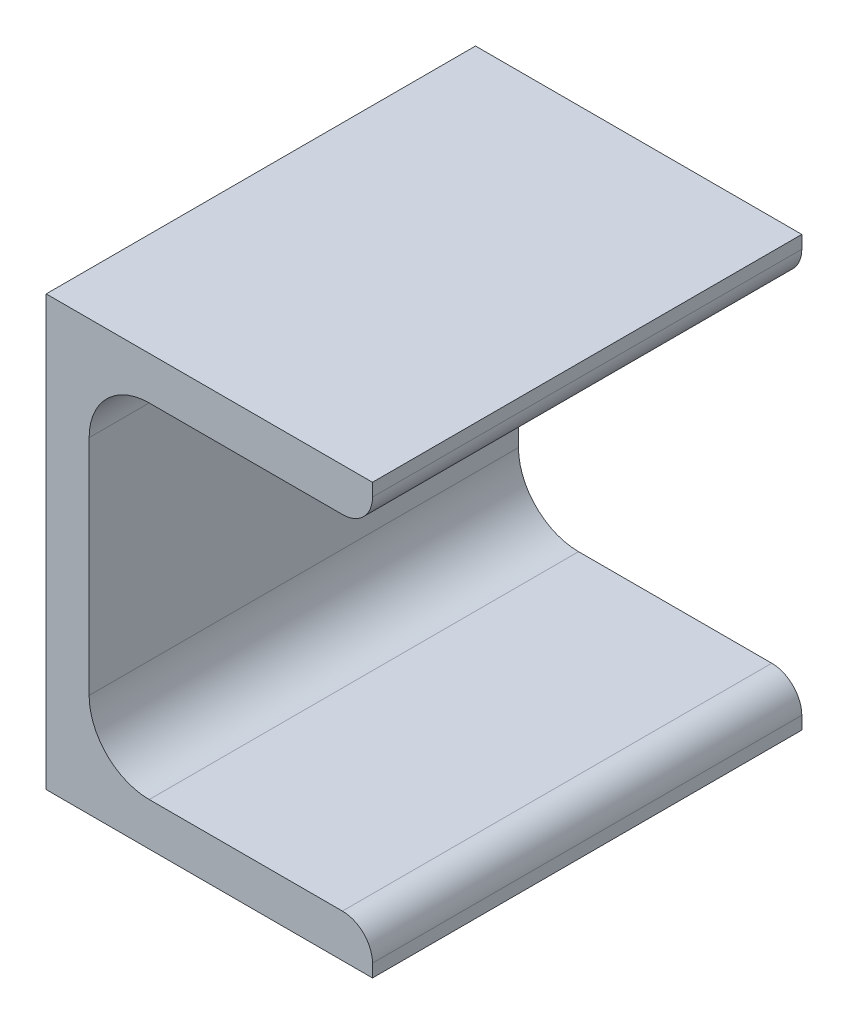
ISO-10303-21;
HEADER;
FILE_DESCRIPTION(('STEP AP214'),'2;1');
FILE_NAME('part.step','',(''),(''),'','','');
FILE_SCHEMA(('AUTOMOTIVE_DESIGN { 1 0 10303 214 1 1 1 1 }'));
ENDSEC;
DATA;
#1=APPLICATION_CONTEXT('core data for automotive mechanical design processes');
#2=APPLICATION_PROTOCOL_DEFINITION('international standard','automotive_design',2000,#1);
#3=PRODUCT_CONTEXT('',#1,'mechanical');
#4=PRODUCT('Part','Part','',(#3));
#5=PRODUCT_RELATED_PRODUCT_CATEGORY('part','',(#4));
#6=PRODUCT_DEFINITION_FORMATION('','',#4);
#7=PRODUCT_DEFINITION_CONTEXT('part definition',#1,'design');
#8=PRODUCT_DEFINITION('design','',#6,#7);
#9=PRODUCT_DEFINITION_SHAPE('','',#8);
#10=(LENGTH_UNIT() NAMED_UNIT(*) SI_UNIT(.MILLI.,.METRE.));
#11=(NAMED_UNIT(*) PLANE_ANGLE_UNIT() SI_UNIT($,.RADIAN.));
#12=(NAMED_UNIT(*) SI_UNIT($,.STERADIAN.) SOLID_ANGLE_UNIT());
#13=UNCERTAINTY_MEASURE_WITH_UNIT(LENGTH_MEASURE(1.E-05),#10,'distance_accuracy_value','');
#14=(GEOMETRIC_REPRESENTATION_CONTEXT(3) GLOBAL_UNCERTAINTY_ASSIGNED_CONTEXT((#13)) GLOBAL_UNIT_ASSIGNED_CONTEXT((#10,
#11,#12)) REPRESENTATION_CONTEXT('',''));
#15=CARTESIAN_POINT('',(0.,0.,0.));
#16=DIRECTION('',(0.,0.,1.));
#17=DIRECTION('',(1.,0.,0.));
#18=AXIS2_PLACEMENT_3D('',#15,#16,#17);
#19=CARTESIAN_POINT('',(38.,0.,50.));
#20=DIRECTION('',(0.,-1.,0.));
#21=DIRECTION('',(1.,0.,0.));
#22=AXIS2_PLACEMENT_3D('',#19,#20,#21);
#23=PLANE('',#22);
#24=DIRECTION('',(-1.,0.,0.));
#25=VECTOR('',#24,1.);
#26=CARTESIAN_POINT('',(38.,0.,0.));
#27=LINE('',#26,#25);
#28=CARTESIAN_POINT('',(38.,0.,0.));
#29=VERTEX_POINT('',#28);
#30=CARTESIAN_POINT('',(0.,0.,0.));
#31=VERTEX_POINT('',#30);
#32=EDGE_CURVE('E153',#29,#31,#27,.T.);
#33=ORIENTED_EDGE('',*,*,#32,.T.);
#34=DIRECTION('',(0.,0.,-1.));
#35=VECTOR('',#34,1.);
#36=CARTESIAN_POINT('',(0.,0.,50.));
#37=LINE('',#36,#35);
#38=CARTESIAN_POINT('',(0.,0.,50.));
#39=VERTEX_POINT('',#38);
#40=EDGE_CURVE('E11',#39,#31,#37,.T.);
#41=ORIENTED_EDGE('',*,*,#40,.F.);
#42=DIRECTION('',(-1.,0.,0.));
#43=VECTOR('',#42,1.);
#44=CARTESIAN_POINT('',(38.,0.,50.));
#45=LINE('',#44,#43);
#46=CARTESIAN_POINT('',(38.,0.,50.));
#47=VERTEX_POINT('',#46);
#48=EDGE_CURVE('E175',#47,#39,#45,.T.);
#49=ORIENTED_EDGE('',*,*,#48,.F.);
#50=DIRECTION('',(0.,0.,-1.));
#51=VECTOR('',#50,1.);
#52=CARTESIAN_POINT('',(38.,0.,50.));
#53=LINE('',#52,#51);
#54=EDGE_CURVE('E149',#47,#29,#53,.T.);
#55=ORIENTED_EDGE('',*,*,#54,.T.);
#56=EDGE_LOOP('',(#33,#41,#49,#55));
#57=FACE_BOUND('',#56,.T.);
#58=ADVANCED_FACE('F33',(#57),#23,.F.);
#59=CARTESIAN_POINT('',(0.,0.,50.));
#60=DIRECTION('',(1.,0.,0.));
#61=DIRECTION('',(0.,0.,-1.));
#62=AXIS2_PLACEMENT_3D('',#59,#60,#61);
#63=PLANE('',#62);
#64=DIRECTION('',(0.,-1.,0.));
#65=VECTOR('',#64,1.);
#66=CARTESIAN_POINT('',(0.,0.,0.));
#67=LINE('',#66,#65);
#68=CARTESIAN_POINT('',(0.,-50.,0.));
#69=VERTEX_POINT('',#68);
#70=EDGE_CURVE('E156',#31,#69,#67,.T.);
#71=ORIENTED_EDGE('',*,*,#70,.T.);
#72=DIRECTION('',(0.,0.,-1.));
#73=VECTOR('',#72,1.);
#74=CARTESIAN_POINT('',(0.,-50.,50.));
#75=LINE('',#74,#73);
#76=CARTESIAN_POINT('',(0.,-50.,50.));
#77=VERTEX_POINT('',#76);
#78=EDGE_CURVE('E41',#77,#69,#75,.T.);
#79=ORIENTED_EDGE('',*,*,#78,.F.);
#80=DIRECTION('',(0.,-1.,0.));
#81=VECTOR('',#80,1.);
#82=CARTESIAN_POINT('',(0.,0.,50.));
#83=LINE('',#82,#81);
#84=EDGE_CURVE('E104',#39,#77,#83,.T.);
#85=ORIENTED_EDGE('',*,*,#84,.F.);
#86=ORIENTED_EDGE('',*,*,#40,.T.);
#87=EDGE_LOOP('',(#71,#79,#85,#86));
#88=FACE_BOUND('',#87,.T.);
#89=ADVANCED_FACE('F253',(#88),#63,.F.);
#90=CARTESIAN_POINT('',(0.,-50.,50.));
#91=DIRECTION('',(0.,1.,0.));
#92=DIRECTION('',(-1.,0.,0.));
#93=AXIS2_PLACEMENT_3D('',#90,#91,#92);
#94=PLANE('',#93);
#95=DIRECTION('',(1.,0.,0.));
#96=VECTOR('',#95,1.);
#97=CARTESIAN_POINT('',(0.,-50.,0.));
#98=LINE('',#97,#96);
#99=CARTESIAN_POINT('',(38.,-50.,0.));
#100=VERTEX_POINT('',#99);
#101=EDGE_CURVE('E158',#69,#100,#98,.T.);
#102=ORIENTED_EDGE('',*,*,#101,.T.);
#103=DIRECTION('',(0.,0.,-1.));
#104=VECTOR('',#103,1.);
#105=CARTESIAN_POINT('',(38.,-50.,50.));
#106=LINE('',#105,#104);
#107=CARTESIAN_POINT('',(38.,-50.,50.));
#108=VERTEX_POINT('',#107);
#109=EDGE_CURVE('E194',#108,#100,#106,.T.);
#110=ORIENTED_EDGE('',*,*,#109,.F.);
#111=DIRECTION('',(1.,0.,0.));
#112=VECTOR('',#111,1.);
#113=CARTESIAN_POINT('',(0.,-50.,50.));
#114=LINE('',#113,#112);
#115=EDGE_CURVE('E202',#77,#108,#114,.T.);
#116=ORIENTED_EDGE('',*,*,#115,.F.);
#117=ORIENTED_EDGE('',*,*,#78,.T.);
#118=EDGE_LOOP('',(#102,#110,#116,#117));
#119=FACE_BOUND('',#118,.T.);
#120=ADVANCED_FACE('F200',(#119),#94,.F.);
#121=CARTESIAN_POINT('',(38.,-50.,50.));
#122=DIRECTION('',(-1.,0.,0.));
#123=DIRECTION('',(0.,0.,1.));
#124=AXIS2_PLACEMENT_3D('',#121,#122,#123);
#125=PLANE('',#124);
#126=DIRECTION('',(0.,1.,0.));
#127=VECTOR('',#126,1.);
#128=CARTESIAN_POINT('',(38.,-50.,0.));
#129=LINE('',#128,#127);
#130=CARTESIAN_POINT('',(38.,-48.5,0.));
#131=VERTEX_POINT('',#130);
#132=EDGE_CURVE('E160',#100,#131,#129,.T.);
#133=ORIENTED_EDGE('',*,*,#132,.T.);
#134=DIRECTION('',(0.,0.,-1.));
#135=VECTOR('',#134,1.);
#136=CARTESIAN_POINT('',(38.,-48.5,50.));
#137=LINE('',#136,#135);
#138=CARTESIAN_POINT('',(38.,-48.5,50.));
#139=VERTEX_POINT('',#138);
#140=EDGE_CURVE('E191',#139,#131,#137,.T.);
#141=ORIENTED_EDGE('',*,*,#140,.F.);
#142=DIRECTION('',(0.,1.,0.));
#143=VECTOR('',#142,1.);
#144=CARTESIAN_POINT('',(38.,-50.,50.));
#145=LINE('',#144,#143);
#146=EDGE_CURVE('E220',#108,#139,#145,.T.);
#147=ORIENTED_EDGE('',*,*,#146,.F.);
#148=ORIENTED_EDGE('',*,*,#109,.T.);
#149=EDGE_LOOP('',(#133,#141,#147,#148));
#150=FACE_BOUND('',#149,.T.);
#151=ADVANCED_FACE('F211',(#150),#125,.F.);
#152=CARTESIAN_POINT('',(34.5,-48.5,50.));
#153=DIRECTION('',(0.,0.,-1.));
#154=DIRECTION('',(-1.,0.,0.));
#155=AXIS2_PLACEMENT_3D('',#152,#153,#154);
#156=CYLINDRICAL_SURFACE('',#155,3.5);
#157=CARTESIAN_POINT('',(34.5,-48.5,0.));
#158=DIRECTION('',(0.,0.,1.));
#159=DIRECTION('',(1.,0.,0.));
#160=AXIS2_PLACEMENT_3D('',#157,#158,#159);
#161=CIRCLE('',#160,3.5);
#162=CARTESIAN_POINT('',(34.5,-45.,0.));
#163=VERTEX_POINT('',#162);
#164=EDGE_CURVE('E162',#131,#163,#161,.T.);
#165=ORIENTED_EDGE('',*,*,#164,.T.);
#166=DIRECTION('',(0.,0.,-1.));
#167=VECTOR('',#166,1.);
#168=CARTESIAN_POINT('',(34.5,-45.,50.));
#169=LINE('',#168,#167);
#170=CARTESIAN_POINT('',(34.5,-45.,50.));
#171=VERTEX_POINT('',#170);
#172=EDGE_CURVE('E188',#171,#163,#169,.T.);
#173=ORIENTED_EDGE('',*,*,#172,.F.);
#174=CARTESIAN_POINT('',(34.5,-48.5,50.));
#175=DIRECTION('',(0.,0.,1.));
#176=DIRECTION('',(1.,0.,0.));
#177=AXIS2_PLACEMENT_3D('',#174,#175,#176);
#178=CIRCLE('',#177,3.5);
#179=EDGE_CURVE('E217',#139,#171,#178,.T.);
#180=ORIENTED_EDGE('',*,*,#179,.F.);
#181=ORIENTED_EDGE('',*,*,#140,.T.);
#182=EDGE_LOOP('',(#165,#173,#180,#181));
#183=FACE_BOUND('',#182,.T.);
#184=ADVANCED_FACE('F215',(#183),#156,.T.);
#185=CARTESIAN_POINT('',(34.5,-45.,50.));
#186=DIRECTION('',(0.,-1.,0.));
#187=DIRECTION('',(1.,0.,0.));
#188=AXIS2_PLACEMENT_3D('',#185,#186,#187);
#189=PLANE('',#188);
#190=DIRECTION('',(-1.,0.,0.));
#191=VECTOR('',#190,1.);
#192=CARTESIAN_POINT('',(34.5,-45.,0.));
#193=LINE('',#192,#191);
#194=CARTESIAN_POINT('',(12.0000000000001,-45.,0.));
#195=VERTEX_POINT('',#194);
#196=EDGE_CURVE('E164',#163,#195,#193,.T.);
#197=ORIENTED_EDGE('',*,*,#196,.T.);
#198=DIRECTION('',(0.,0.,-1.));
#199=VECTOR('',#198,1.);
#200=CARTESIAN_POINT('',(12.0000000000001,-45.,50.));
#201=LINE('',#200,#199);
#202=CARTESIAN_POINT('',(12.0000000000001,-45.,50.));
#203=VERTEX_POINT('',#202);
#204=EDGE_CURVE('E185',#203,#195,#201,.T.);
#205=ORIENTED_EDGE('',*,*,#204,.F.);
#206=DIRECTION('',(-1.,0.,0.));
#207=VECTOR('',#206,1.);
#208=CARTESIAN_POINT('',(34.5,-45.,50.));
#209=LINE('',#208,#207);
#210=EDGE_CURVE('E219',#171,#203,#209,.T.);
#211=ORIENTED_EDGE('',*,*,#210,.F.);
#212=ORIENTED_EDGE('',*,*,#172,.T.);
#213=EDGE_LOOP('',(#197,#205,#211,#212));
#214=FACE_BOUND('',#213,.T.);
#215=ADVANCED_FACE('F266',(#214),#189,.F.);
#216=CARTESIAN_POINT('',(12.,-38.,50.));
#217=DIRECTION('',(0.,0.,-1.));
#218=DIRECTION('',(-1.,0.,0.));
#219=AXIS2_PLACEMENT_3D('',#216,#217,#218);
#220=CYLINDRICAL_SURFACE('',#219,7.);
#221=CARTESIAN_POINT('',(12.,-38.,0.));
#222=DIRECTION('',(0.,0.,-1.));
#223=DIRECTION('',(-1.,0.,0.));
#224=AXIS2_PLACEMENT_3D('',#221,#222,#223);
#225=CIRCLE('',#224,7.);
#226=CARTESIAN_POINT('',(5.,-38.,0.));
#227=VERTEX_POINT('',#226);
#228=EDGE_CURVE('E166',#195,#227,#225,.T.);
#229=ORIENTED_EDGE('',*,*,#228,.T.);
#230=DIRECTION('',(0.,0.,-1.));
#231=VECTOR('',#230,1.);
#232=CARTESIAN_POINT('',(5.,-38.,50.));
#233=LINE('',#232,#231);
#234=CARTESIAN_POINT('',(5.,-38.,50.));
#235=VERTEX_POINT('',#234);
#236=EDGE_CURVE('E182',#235,#227,#233,.T.);
#237=ORIENTED_EDGE('',*,*,#236,.F.);
#238=CARTESIAN_POINT('',(12.,-38.,50.));
#239=DIRECTION('',(0.,0.,-1.));
#240=DIRECTION('',(-1.,0.,0.));
#241=AXIS2_PLACEMENT_3D('',#238,#239,#240);
#242=CIRCLE('',#241,7.);
#243=EDGE_CURVE('E222',#203,#235,#242,.T.);
#244=ORIENTED_EDGE('',*,*,#243,.F.);
#245=ORIENTED_EDGE('',*,*,#204,.T.);
#246=EDGE_LOOP('',(#229,#237,#244,#245));
#247=FACE_BOUND('',#246,.T.);
#248=ADVANCED_FACE('F269',(#247),#220,.F.);
#249=CARTESIAN_POINT('',(5.,-38.,50.));
#250=DIRECTION('',(-1.,0.,0.));
#251=DIRECTION('',(0.,0.,1.));
#252=AXIS2_PLACEMENT_3D('',#249,#250,#251);
#253=PLANE('',#252);
#254=DIRECTION('',(0.,1.,0.));
#255=VECTOR('',#254,1.);
#256=CARTESIAN_POINT('',(5.,-38.,0.));
#257=LINE('',#256,#255);
#258=CARTESIAN_POINT('',(5.,-12.,0.));
#259=VERTEX_POINT('',#258);
#260=EDGE_CURVE('E168',#227,#259,#257,.T.);
#261=ORIENTED_EDGE('',*,*,#260,.T.);
#262=DIRECTION('',(0.,0.,-1.));
#263=VECTOR('',#262,1.);
#264=CARTESIAN_POINT('',(5.,-12.,50.));
#265=LINE('',#264,#263);
#266=CARTESIAN_POINT('',(5.,-12.,50.));
#267=VERTEX_POINT('',#266);
#268=EDGE_CURVE('E179',#267,#259,#265,.T.);
#269=ORIENTED_EDGE('',*,*,#268,.F.);
#270=DIRECTION('',(0.,1.,0.));
#271=VECTOR('',#270,1.);
#272=CARTESIAN_POINT('',(5.,-38.,50.));
#273=LINE('',#272,#271);
#274=EDGE_CURVE('E228',#235,#267,#273,.T.);
#275=ORIENTED_EDGE('',*,*,#274,.F.);
#276=ORIENTED_EDGE('',*,*,#236,.T.);
#277=EDGE_LOOP('',(#261,#269,#275,#276));
#278=FACE_BOUND('',#277,.T.);
#279=ADVANCED_FACE('F234',(#278),#253,.F.);
#280=CARTESIAN_POINT('',(12.,-12.,50.));
#281=DIRECTION('',(0.,0.,-1.));
#282=DIRECTION('',(-1.,0.,0.));
#283=AXIS2_PLACEMENT_3D('',#280,#281,#282);
#284=CYLINDRICAL_SURFACE('',#283,7.);
#285=CARTESIAN_POINT('',(12.,-12.,0.));
#286=DIRECTION('',(0.,0.,-1.));
#287=DIRECTION('',(-1.,0.,0.));
#288=AXIS2_PLACEMENT_3D('',#285,#286,#287);
#289=CIRCLE('',#288,7.);
#290=CARTESIAN_POINT('',(12.0000000000001,-5.,0.));
#291=VERTEX_POINT('',#290);
#292=EDGE_CURVE('E170',#259,#291,#289,.T.);
#293=ORIENTED_EDGE('',*,*,#292,.T.);
#294=DIRECTION('',(0.,0.,-1.));
#295=VECTOR('',#294,1.);
#296=CARTESIAN_POINT('',(12.0000000000001,-5.,50.));
#297=LINE('',#296,#295);
#298=CARTESIAN_POINT('',(12.0000000000001,-5.,50.));
#299=VERTEX_POINT('',#298);
#300=EDGE_CURVE('E144',#299,#291,#297,.T.);
#301=ORIENTED_EDGE('',*,*,#300,.F.);
#302=CARTESIAN_POINT('',(12.,-12.,50.));
#303=DIRECTION('',(0.,0.,-1.));
#304=DIRECTION('',(-1.,0.,0.));
#305=AXIS2_PLACEMENT_3D('',#302,#303,#304);
#306=CIRCLE('',#305,7.);
#307=EDGE_CURVE('E135',#267,#299,#306,.T.);
#308=ORIENTED_EDGE('',*,*,#307,.F.);
#309=ORIENTED_EDGE('',*,*,#268,.T.);
#310=EDGE_LOOP('',(#293,#301,#308,#309));
#311=FACE_BOUND('',#310,.T.);
#312=ADVANCED_FACE('F238',(#311),#284,.F.);
#313=CARTESIAN_POINT('',(12.0000000000001,-5.,50.));
#314=DIRECTION('',(0.,1.,0.));
#315=DIRECTION('',(0.,0.,1.));
#316=AXIS2_PLACEMENT_3D('',#313,#314,#315);
#317=PLANE('',#316);
#318=DIRECTION('',(1.,0.,0.));
#319=VECTOR('',#318,1.);
#320=CARTESIAN_POINT('',(12.0000000000001,-5.,0.));
#321=LINE('',#320,#319);
#322=CARTESIAN_POINT('',(34.5,-5.,0.));
#323=VERTEX_POINT('',#322);
#324=EDGE_CURVE('E143',#291,#323,#321,.T.);
#325=ORIENTED_EDGE('',*,*,#324,.T.);
#326=DIRECTION('',(0.,0.,-1.));
#327=VECTOR('',#326,1.);
#328=CARTESIAN_POINT('',(34.5,-5.,50.));
#329=LINE('',#328,#327);
#330=CARTESIAN_POINT('',(34.5,-5.,50.));
#331=VERTEX_POINT('',#330);
#332=EDGE_CURVE('E140',#331,#323,#329,.T.);
#333=ORIENTED_EDGE('',*,*,#332,.F.);
#334=DIRECTION('',(1.,0.,0.));
#335=VECTOR('',#334,1.);
#336=CARTESIAN_POINT('',(12.0000000000001,-5.,50.));
#337=LINE('',#336,#335);
#338=EDGE_CURVE('E129',#299,#331,#337,.T.);
#339=ORIENTED_EDGE('',*,*,#338,.F.);
#340=ORIENTED_EDGE('',*,*,#300,.T.);
#341=EDGE_LOOP('',(#325,#333,#339,#340));
#342=FACE_BOUND('',#341,.T.);
#343=ADVANCED_FACE('F141',(#342),#317,.F.);
#344=CARTESIAN_POINT('',(34.5,-1.5,50.));
#345=DIRECTION('',(0.,0.,-1.));
#346=DIRECTION('',(-1.,0.,0.));
#347=AXIS2_PLACEMENT_3D('',#344,#345,#346);
#348=CYLINDRICAL_SURFACE('',#347,3.5);
#349=CARTESIAN_POINT('',(34.5,-1.5,0.));
#350=DIRECTION('',(0.,0.,1.));
#351=DIRECTION('',(1.,0.,0.));
#352=AXIS2_PLACEMENT_3D('',#349,#350,#351);
#353=CIRCLE('',#352,3.5);
#354=CARTESIAN_POINT('',(38.,-1.5,0.));
#355=VERTEX_POINT('',#354);
#356=EDGE_CURVE('E90',#323,#355,#353,.T.);
#357=ORIENTED_EDGE('',*,*,#356,.T.);
#358=DIRECTION('',(0.,0.,-1.));
#359=VECTOR('',#358,1.);
#360=CARTESIAN_POINT('',(38.,-1.5,50.));
#361=LINE('',#360,#359);
#362=CARTESIAN_POINT('',(38.,-1.5,50.));
#363=VERTEX_POINT('',#362);
#364=EDGE_CURVE('E145',#363,#355,#361,.T.);
#365=ORIENTED_EDGE('',*,*,#364,.F.);
#366=CARTESIAN_POINT('',(34.5,-1.5,50.));
#367=DIRECTION('',(0.,0.,1.));
#368=DIRECTION('',(1.,0.,0.));
#369=AXIS2_PLACEMENT_3D('',#366,#367,#368);
#370=CIRCLE('',#369,3.5);
#371=EDGE_CURVE('E133',#331,#363,#370,.T.);
#372=ORIENTED_EDGE('',*,*,#371,.F.);
#373=ORIENTED_EDGE('',*,*,#332,.T.);
#374=EDGE_LOOP('',(#357,#365,#372,#373));
#375=FACE_BOUND('',#374,.T.);
#376=ADVANCED_FACE('F147',(#375),#348,.T.);
#377=CARTESIAN_POINT('',(38.,-1.49999999999997,50.));
#378=DIRECTION('',(-1.,0.,0.));
#379=DIRECTION('',(0.,0.,1.));
#380=AXIS2_PLACEMENT_3D('',#377,#378,#379);
#381=PLANE('',#380);
#382=DIRECTION('',(0.,1.,0.));
#383=VECTOR('',#382,1.);
#384=CARTESIAN_POINT('',(38.,-1.49999999999997,0.));
#385=LINE('',#384,#383);
#386=EDGE_CURVE('E96',#355,#29,#385,.T.);
#387=ORIENTED_EDGE('',*,*,#386,.T.);
#388=ORIENTED_EDGE('',*,*,#54,.F.);
#389=DIRECTION('',(0.,1.,0.));
#390=VECTOR('',#389,1.);
#391=CARTESIAN_POINT('',(38.,-1.49999999999997,50.));
#392=LINE('',#391,#390);
#393=EDGE_CURVE('E49',#363,#47,#392,.T.);
#394=ORIENTED_EDGE('',*,*,#393,.F.);
#395=ORIENTED_EDGE('',*,*,#364,.T.);
#396=EDGE_LOOP('',(#387,#388,#394,#395));
#397=FACE_BOUND('',#396,.T.);
#398=ADVANCED_FACE('F242',(#397),#381,.F.);
#399=CARTESIAN_POINT('',(34.5,-48.5,50.));
#400=DIRECTION('',(0.,0.,1.));
#401=DIRECTION('',(1.,0.,0.));
#402=AXIS2_PLACEMENT_3D('',#399,#400,#401);
#403=PLANE('',#402);
#404=ORIENTED_EDGE('',*,*,#48,.T.);
#405=ORIENTED_EDGE('',*,*,#84,.T.);
#406=ORIENTED_EDGE('',*,*,#115,.T.);
#407=ORIENTED_EDGE('',*,*,#146,.T.);
#408=ORIENTED_EDGE('',*,*,#179,.T.);
#409=ORIENTED_EDGE('',*,*,#210,.T.);
#410=ORIENTED_EDGE('',*,*,#243,.T.);
#411=ORIENTED_EDGE('',*,*,#274,.T.);
#412=ORIENTED_EDGE('',*,*,#307,.T.);
#413=ORIENTED_EDGE('',*,*,#338,.T.);
#414=ORIENTED_EDGE('',*,*,#371,.T.);
#415=ORIENTED_EDGE('',*,*,#393,.T.);
#416=EDGE_LOOP('',(#404,#405,#406,#407,#408,#409,#410,#411,#412,#413,#414,#415));
#417=FACE_BOUND('',#416,.T.);
#418=ADVANCED_FACE('F131',(#417),#403,.T.);
#419=CARTESIAN_POINT('',(34.5,-48.5,0.));
#420=DIRECTION('',(0.,0.,1.));
#421=DIRECTION('',(1.,0.,0.));
#422=AXIS2_PLACEMENT_3D('',#419,#420,#421);
#423=PLANE('',#422);
#424=ORIENTED_EDGE('',*,*,#32,.F.);
#425=ORIENTED_EDGE('',*,*,#386,.F.);
#426=ORIENTED_EDGE('',*,*,#356,.F.);
#427=ORIENTED_EDGE('',*,*,#324,.F.);
#428=ORIENTED_EDGE('',*,*,#292,.F.);
#429=ORIENTED_EDGE('',*,*,#260,.F.);
#430=ORIENTED_EDGE('',*,*,#228,.F.);
#431=ORIENTED_EDGE('',*,*,#196,.F.);
#432=ORIENTED_EDGE('',*,*,#164,.F.);
#433=ORIENTED_EDGE('',*,*,#132,.F.);
#434=ORIENTED_EDGE('',*,*,#101,.F.);
#435=ORIENTED_EDGE('',*,*,#70,.F.);
#436=EDGE_LOOP('',(#424,#425,#426,#427,#428,#429,#430,#431,#432,#433,#434,#435));
#437=FACE_BOUND('',#436,.T.);
#438=ADVANCED_FACE('F206',(#437),#423,.F.);
#439=CLOSED_SHELL('',(#58,#89,#120,#151,#184,#215,#248,#279,#312,#343,#376,#398,#418,#438));
#440=MANIFOLD_SOLID_BREP('B2',#439);
#441=ADVANCED_BREP_SHAPE_REPRESENTATION('',(#18,#440),#14);
#442=SHAPE_DEFINITION_REPRESENTATION(#9,#441);
ENDSEC;
END-ISO-10303-21;
